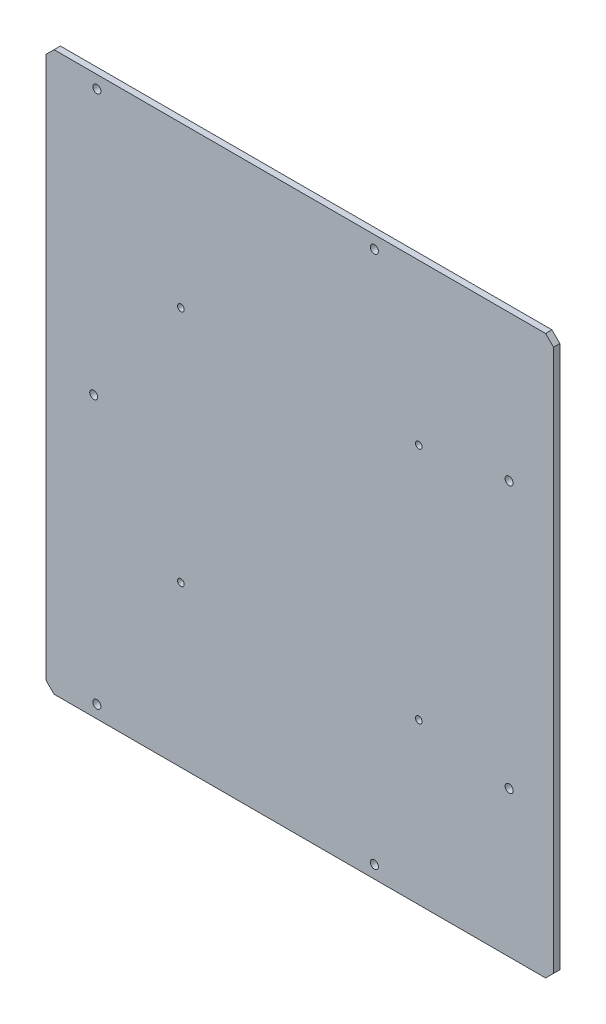
ISO-10303-21;
HEADER;
FILE_DESCRIPTION(('STEP AP214'),'2;1');
FILE_NAME('part.step','',(''),(''),'','','');
FILE_SCHEMA(('AUTOMOTIVE_DESIGN { 1 0 10303 214 1 1 1 1 }'));
ENDSEC;
DATA;
#1=APPLICATION_CONTEXT('core data for automotive mechanical design processes');
#2=APPLICATION_PROTOCOL_DEFINITION('international standard','automotive_design',2000,#1);
#3=PRODUCT_CONTEXT('',#1,'mechanical');
#4=PRODUCT('Part','Part','',(#3));
#5=PRODUCT_RELATED_PRODUCT_CATEGORY('part','',(#4));
#6=PRODUCT_DEFINITION_FORMATION('','',#4);
#7=PRODUCT_DEFINITION_CONTEXT('part definition',#1,'design');
#8=PRODUCT_DEFINITION('design','',#6,#7);
#9=PRODUCT_DEFINITION_SHAPE('','',#8);
#10=(LENGTH_UNIT() NAMED_UNIT(*) SI_UNIT(.MILLI.,.METRE.));
#11=(NAMED_UNIT(*) PLANE_ANGLE_UNIT() SI_UNIT($,.RADIAN.));
#12=(NAMED_UNIT(*) SI_UNIT($,.STERADIAN.) SOLID_ANGLE_UNIT());
#13=UNCERTAINTY_MEASURE_WITH_UNIT(LENGTH_MEASURE(1.E-05),#10,'distance_accuracy_value','');
#14=(GEOMETRIC_REPRESENTATION_CONTEXT(3) GLOBAL_UNCERTAINTY_ASSIGNED_CONTEXT((#13)) GLOBAL_UNIT_ASSIGNED_CONTEXT((#10,
#11,#12)) REPRESENTATION_CONTEXT('',''));
#15=CARTESIAN_POINT('',(0.,0.,0.));
#16=DIRECTION('',(0.,0.,1.));
#17=DIRECTION('',(1.,0.,0.));
#18=AXIS2_PLACEMENT_3D('',#15,#16,#17);
#19=CARTESIAN_POINT('',(155.,176.,4.));
#20=DIRECTION('',(0.,-1.,0.));
#21=DIRECTION('',(1.,0.,0.));
#22=AXIS2_PLACEMENT_3D('',#19,#20,#21);
#23=PLANE('',#22);
#24=DIRECTION('',(-1.,0.,0.));
#25=VECTOR('',#24,1.);
#26=CARTESIAN_POINT('',(155.,176.,0.));
#27=LINE('',#26,#25);
#28=CARTESIAN_POINT('',(155.,176.,0.));
#29=VERTEX_POINT('',#28);
#30=CARTESIAN_POINT('',(-155.,176.,0.));
#31=VERTEX_POINT('',#30);
#32=EDGE_CURVE('E128',#29,#31,#27,.T.);
#33=ORIENTED_EDGE('',*,*,#32,.T.);
#34=DIRECTION('',(0.,0.,-1.));
#35=VECTOR('',#34,1.);
#36=CARTESIAN_POINT('',(-155.,176.,4.));
#37=LINE('',#36,#35);
#38=CARTESIAN_POINT('',(-155.,176.,4.));
#39=VERTEX_POINT('',#38);
#40=EDGE_CURVE('E11',#39,#31,#37,.T.);
#41=ORIENTED_EDGE('',*,*,#40,.F.);
#42=DIRECTION('',(-1.,0.,0.));
#43=VECTOR('',#42,1.);
#44=CARTESIAN_POINT('',(155.,176.,4.));
#45=LINE('',#44,#43);
#46=CARTESIAN_POINT('',(155.,176.,4.));
#47=VERTEX_POINT('',#46);
#48=EDGE_CURVE('E143',#47,#39,#45,.T.);
#49=ORIENTED_EDGE('',*,*,#48,.F.);
#50=DIRECTION('',(0.,0.,-1.));
#51=VECTOR('',#50,1.);
#52=CARTESIAN_POINT('',(155.,176.,4.));
#53=LINE('',#52,#51);
#54=EDGE_CURVE('E124',#47,#29,#53,.T.);
#55=ORIENTED_EDGE('',*,*,#54,.T.);
#56=EDGE_LOOP('',(#33,#41,#49,#55));
#57=FACE_BOUND('',#56,.T.);
#58=ADVANCED_FACE('F32',(#57),#23,.F.);
#59=CARTESIAN_POINT('',(-155.,176.,4.));
#60=DIRECTION('',(0.70710678118655,-0.707106781186546,0.));
#61=DIRECTION('',(0.707106781186546,0.70710678118655,0.));
#62=AXIS2_PLACEMENT_3D('',#59,#60,#61);
#63=PLANE('',#62);
#64=DIRECTION('',(-0.707106781186545,-0.707106781186549,0.));
#65=VECTOR('',#64,1.);
#66=CARTESIAN_POINT('',(-155.,176.,0.));
#67=LINE('',#66,#65);
#68=CARTESIAN_POINT('',(-160.,171.,0.));
#69=VERTEX_POINT('',#68);
#70=EDGE_CURVE('E131',#31,#69,#67,.T.);
#71=ORIENTED_EDGE('',*,*,#70,.T.);
#72=DIRECTION('',(0.,0.,-1.));
#73=VECTOR('',#72,1.);
#74=CARTESIAN_POINT('',(-160.,171.,4.));
#75=LINE('',#74,#73);
#76=CARTESIAN_POINT('',(-160.,171.,4.));
#77=VERTEX_POINT('',#76);
#78=EDGE_CURVE('E40',#77,#69,#75,.T.);
#79=ORIENTED_EDGE('',*,*,#78,.F.);
#80=DIRECTION('',(-0.707106781186545,-0.707106781186549,0.));
#81=VECTOR('',#80,1.);
#82=CARTESIAN_POINT('',(-155.,176.,4.));
#83=LINE('',#82,#81);
#84=EDGE_CURVE('E91',#39,#77,#83,.T.);
#85=ORIENTED_EDGE('',*,*,#84,.F.);
#86=ORIENTED_EDGE('',*,*,#40,.T.);
#87=EDGE_LOOP('',(#71,#79,#85,#86));
#88=FACE_BOUND('',#87,.T.);
#89=ADVANCED_FACE('F288',(#88),#63,.F.);
#90=CARTESIAN_POINT('',(-160.,-171.,4.));
#91=DIRECTION('',(1.,0.,0.));
#92=DIRECTION('',(0.,0.,-1.));
#93=AXIS2_PLACEMENT_3D('',#90,#91,#92);
#94=PLANE('',#93);
#95=DIRECTION('',(0.,-1.,0.));
#96=VECTOR('',#95,1.);
#97=CARTESIAN_POINT('',(-160.,-171.,0.));
#98=LINE('',#97,#96);
#99=CARTESIAN_POINT('',(-160.,-171.,0.));
#100=VERTEX_POINT('',#99);
#101=EDGE_CURVE('E134',#69,#100,#98,.T.);
#102=ORIENTED_EDGE('',*,*,#101,.T.);
#103=DIRECTION('',(0.,0.,-1.));
#104=VECTOR('',#103,1.);
#105=CARTESIAN_POINT('',(-160.,-171.,4.));
#106=LINE('',#105,#104);
#107=CARTESIAN_POINT('',(-160.,-171.,4.));
#108=VERTEX_POINT('',#107);
#109=EDGE_CURVE('E150',#108,#100,#106,.T.);
#110=ORIENTED_EDGE('',*,*,#109,.F.);
#111=DIRECTION('',(0.,-1.,0.));
#112=VECTOR('',#111,1.);
#113=CARTESIAN_POINT('',(-160.,-171.,4.));
#114=LINE('',#113,#112);
#115=EDGE_CURVE('E158',#77,#108,#114,.T.);
#116=ORIENTED_EDGE('',*,*,#115,.F.);
#117=ORIENTED_EDGE('',*,*,#78,.T.);
#118=EDGE_LOOP('',(#102,#110,#116,#117));
#119=FACE_BOUND('',#118,.T.);
#120=ADVANCED_FACE('F156',(#119),#94,.F.);
#121=CARTESIAN_POINT('',(-155.,-176.,4.));
#122=DIRECTION('',(0.707106781186547,0.707106781186547,0.));
#123=DIRECTION('',(-0.707106781186548,0.707106781186548,0.));
#124=AXIS2_PLACEMENT_3D('',#121,#122,#123);
#125=PLANE('',#124);
#126=DIRECTION('',(0.707106781186547,-0.707106781186547,0.));
#127=VECTOR('',#126,1.);
#128=CARTESIAN_POINT('',(-155.,-176.,0.));
#129=LINE('',#128,#127);
#130=CARTESIAN_POINT('',(-155.,-176.,0.));
#131=VERTEX_POINT('',#130);
#132=EDGE_CURVE('E136',#100,#131,#129,.T.);
#133=ORIENTED_EDGE('',*,*,#132,.T.);
#134=DIRECTION('',(0.,0.,-1.));
#135=VECTOR('',#134,1.);
#136=CARTESIAN_POINT('',(-155.,-176.,4.));
#137=LINE('',#136,#135);
#138=CARTESIAN_POINT('',(-155.,-176.,4.));
#139=VERTEX_POINT('',#138);
#140=EDGE_CURVE('E147',#139,#131,#137,.T.);
#141=ORIENTED_EDGE('',*,*,#140,.F.);
#142=DIRECTION('',(0.707106781186547,-0.707106781186547,0.));
#143=VECTOR('',#142,1.);
#144=CARTESIAN_POINT('',(-155.,-176.,4.));
#145=LINE('',#144,#143);
#146=EDGE_CURVE('E170',#108,#139,#145,.T.);
#147=ORIENTED_EDGE('',*,*,#146,.F.);
#148=ORIENTED_EDGE('',*,*,#109,.T.);
#149=EDGE_LOOP('',(#133,#141,#147,#148));
#150=FACE_BOUND('',#149,.T.);
#151=ADVANCED_FACE('F166',(#150),#125,.F.);
#152=CARTESIAN_POINT('',(155.,-176.,4.));
#153=DIRECTION('',(0.,1.,0.));
#154=DIRECTION('',(-1.,0.,0.));
#155=AXIS2_PLACEMENT_3D('',#152,#153,#154);
#156=PLANE('',#155);
#157=DIRECTION('',(1.,0.,0.));
#158=VECTOR('',#157,1.);
#159=CARTESIAN_POINT('',(155.,-176.,0.));
#160=LINE('',#159,#158);
#161=CARTESIAN_POINT('',(155.,-176.,0.));
#162=VERTEX_POINT('',#161);
#163=EDGE_CURVE('E138',#131,#162,#160,.T.);
#164=ORIENTED_EDGE('',*,*,#163,.T.);
#165=DIRECTION('',(0.,0.,-1.));
#166=VECTOR('',#165,1.);
#167=CARTESIAN_POINT('',(155.,-176.,4.));
#168=LINE('',#167,#166);
#169=CARTESIAN_POINT('',(155.,-176.,4.));
#170=VERTEX_POINT('',#169);
#171=EDGE_CURVE('E119',#170,#162,#168,.T.);
#172=ORIENTED_EDGE('',*,*,#171,.F.);
#173=DIRECTION('',(1.,0.,0.));
#174=VECTOR('',#173,1.);
#175=CARTESIAN_POINT('',(155.,-176.,4.));
#176=LINE('',#175,#174);
#177=EDGE_CURVE('E110',#139,#170,#176,.T.);
#178=ORIENTED_EDGE('',*,*,#177,.F.);
#179=ORIENTED_EDGE('',*,*,#140,.T.);
#180=EDGE_LOOP('',(#164,#172,#178,#179));
#181=FACE_BOUND('',#180,.T.);
#182=ADVANCED_FACE('F169',(#181),#156,.F.);
#183=CARTESIAN_POINT('',(160.,-171.,4.));
#184=DIRECTION('',(-0.707106781186547,0.707106781186547,0.));
#185=DIRECTION('',(-0.707106781186548,-0.707106781186548,0.));
#186=AXIS2_PLACEMENT_3D('',#183,#184,#185);
#187=PLANE('',#186);
#188=DIRECTION('',(0.707106781186547,0.707106781186547,0.));
#189=VECTOR('',#188,1.);
#190=CARTESIAN_POINT('',(160.,-171.,0.));
#191=LINE('',#190,#189);
#192=CARTESIAN_POINT('',(160.,-171.,0.));
#193=VERTEX_POINT('',#192);
#194=EDGE_CURVE('E118',#162,#193,#191,.T.);
#195=ORIENTED_EDGE('',*,*,#194,.T.);
#196=DIRECTION('',(0.,0.,-1.));
#197=VECTOR('',#196,1.);
#198=CARTESIAN_POINT('',(160.,-171.,4.));
#199=LINE('',#198,#197);
#200=CARTESIAN_POINT('',(160.,-171.,4.));
#201=VERTEX_POINT('',#200);
#202=EDGE_CURVE('E115',#201,#193,#199,.T.);
#203=ORIENTED_EDGE('',*,*,#202,.F.);
#204=DIRECTION('',(0.707106781186547,0.707106781186547,0.));
#205=VECTOR('',#204,1.);
#206=CARTESIAN_POINT('',(160.,-171.,4.));
#207=LINE('',#206,#205);
#208=EDGE_CURVE('E104',#170,#201,#207,.T.);
#209=ORIENTED_EDGE('',*,*,#208,.F.);
#210=ORIENTED_EDGE('',*,*,#171,.T.);
#211=EDGE_LOOP('',(#195,#203,#209,#210));
#212=FACE_BOUND('',#211,.T.);
#213=ADVANCED_FACE('F116',(#212),#187,.F.);
#214=CARTESIAN_POINT('',(160.,-171.,4.));
#215=DIRECTION('',(-1.,0.,0.));
#216=DIRECTION('',(0.,0.,1.));
#217=AXIS2_PLACEMENT_3D('',#214,#215,#216);
#218=PLANE('',#217);
#219=DIRECTION('',(0.,1.,0.));
#220=VECTOR('',#219,1.);
#221=CARTESIAN_POINT('',(160.,-171.,0.));
#222=LINE('',#221,#220);
#223=CARTESIAN_POINT('',(160.,171.,0.));
#224=VERTEX_POINT('',#223);
#225=EDGE_CURVE('E77',#193,#224,#222,.T.);
#226=ORIENTED_EDGE('',*,*,#225,.T.);
#227=DIRECTION('',(0.,0.,-1.));
#228=VECTOR('',#227,1.);
#229=CARTESIAN_POINT('',(160.,171.,4.));
#230=LINE('',#229,#228);
#231=CARTESIAN_POINT('',(160.,171.,4.));
#232=VERTEX_POINT('',#231);
#233=EDGE_CURVE('E120',#232,#224,#230,.T.);
#234=ORIENTED_EDGE('',*,*,#233,.F.);
#235=DIRECTION('',(0.,1.,0.));
#236=VECTOR('',#235,1.);
#237=CARTESIAN_POINT('',(160.,-171.,4.));
#238=LINE('',#237,#236);
#239=EDGE_CURVE('E108',#201,#232,#238,.T.);
#240=ORIENTED_EDGE('',*,*,#239,.F.);
#241=ORIENTED_EDGE('',*,*,#202,.T.);
#242=EDGE_LOOP('',(#226,#234,#240,#241));
#243=FACE_BOUND('',#242,.T.);
#244=ADVANCED_FACE('F122',(#243),#218,.F.);
#245=CARTESIAN_POINT('',(160.,171.,4.));
#246=DIRECTION('',(-0.707106781186552,-0.707106781186544,0.));
#247=DIRECTION('',(0.707106781186544,-0.707106781186551,0.));
#248=AXIS2_PLACEMENT_3D('',#245,#246,#247);
#249=PLANE('',#248);
#250=DIRECTION('',(-0.707106781186543,0.707106781186551,0.));
#251=VECTOR('',#250,1.);
#252=CARTESIAN_POINT('',(160.,171.,0.));
#253=LINE('',#252,#251);
#254=EDGE_CURVE('E83',#224,#29,#253,.T.);
#255=ORIENTED_EDGE('',*,*,#254,.T.);
#256=ORIENTED_EDGE('',*,*,#54,.F.);
#257=DIRECTION('',(-0.707106781186543,0.707106781186551,0.));
#258=VECTOR('',#257,1.);
#259=CARTESIAN_POINT('',(160.,171.,4.));
#260=LINE('',#259,#258);
#261=EDGE_CURVE('E48',#232,#47,#260,.T.);
#262=ORIENTED_EDGE('',*,*,#261,.F.);
#263=ORIENTED_EDGE('',*,*,#233,.T.);
#264=EDGE_LOOP('',(#255,#256,#262,#263));
#265=FACE_BOUND('',#264,.T.);
#266=ADVANCED_FACE('F253',(#265),#249,.F.);
#267=CARTESIAN_POINT('',(0.,0.,4.));
#268=DIRECTION('',(0.,0.,-1.));
#269=DIRECTION('',(-1.,0.,0.));
#270=AXIS2_PLACEMENT_3D('',#267,#268,#269);
#271=PLANE('',#270);
#272=CARTESIAN_POINT('',(75.,-75.,4.));
#273=DIRECTION('',(0.,0.,1.));
#274=DIRECTION('',(-1.,0.,0.));
#275=AXIS2_PLACEMENT_3D('',#272,#273,#274);
#276=CIRCLE('',#275,2.1);
#277=CARTESIAN_POINT('',(72.9,-75.,4.));
#278=VERTEX_POINT('',#277);
#279=EDGE_CURVE('E236',#278,#278,#276,.T.);
#280=ORIENTED_EDGE('',*,*,#279,.F.);
#281=EDGE_LOOP('',(#280));
#282=FACE_BOUND('',#281,.T.);
#283=CARTESIAN_POINT('',(75.,75.,4.));
#284=DIRECTION('',(0.,0.,1.));
#285=DIRECTION('',(1.,0.,0.));
#286=AXIS2_PLACEMENT_3D('',#283,#284,#285);
#287=CIRCLE('',#286,2.1);
#288=CARTESIAN_POINT('',(77.1,75.,4.));
#289=VERTEX_POINT('',#288);
#290=EDGE_CURVE('E230',#289,#289,#287,.T.);
#291=ORIENTED_EDGE('',*,*,#290,.F.);
#292=EDGE_LOOP('',(#291));
#293=FACE_BOUND('',#292,.T.);
#294=CARTESIAN_POINT('',(-75.,75.,4.));
#295=DIRECTION('',(0.,0.,1.));
#296=DIRECTION('',(-1.,0.,0.));
#297=AXIS2_PLACEMENT_3D('',#294,#295,#296);
#298=CIRCLE('',#297,2.1);
#299=CARTESIAN_POINT('',(-77.1,75.,4.));
#300=VERTEX_POINT('',#299);
#301=EDGE_CURVE('E224',#300,#300,#298,.T.);
#302=ORIENTED_EDGE('',*,*,#301,.F.);
#303=EDGE_LOOP('',(#302));
#304=FACE_BOUND('',#303,.T.);
#305=CARTESIAN_POINT('',(-75.,-75.,4.));
#306=DIRECTION('',(0.,0.,1.));
#307=DIRECTION('',(1.,0.,0.));
#308=AXIS2_PLACEMENT_3D('',#305,#306,#307);
#309=CIRCLE('',#308,2.1);
#310=CARTESIAN_POINT('',(-72.9,-75.,4.));
#311=VERTEX_POINT('',#310);
#312=EDGE_CURVE('E218',#311,#311,#309,.T.);
#313=ORIENTED_EDGE('',*,*,#312,.F.);
#314=EDGE_LOOP('',(#313));
#315=FACE_BOUND('',#314,.T.);
#316=CARTESIAN_POINT('',(47.,168.,4.));
#317=DIRECTION('',(0.,0.,1.));
#318=DIRECTION('',(1.,0.,0.));
#319=AXIS2_PLACEMENT_3D('',#316,#317,#318);
#320=CIRCLE('',#319,2.55000000000005);
#321=CARTESIAN_POINT('',(49.55,168.,4.));
#322=VERTEX_POINT('',#321);
#323=EDGE_CURVE('E213',#322,#322,#320,.T.);
#324=ORIENTED_EDGE('',*,*,#323,.F.);
#325=EDGE_LOOP('',(#324));
#326=FACE_BOUND('',#325,.T.);
#327=CARTESIAN_POINT('',(132.,84.,4.));
#328=DIRECTION('',(0.,0.,1.));
#329=DIRECTION('',(1.,0.,0.));
#330=AXIS2_PLACEMENT_3D('',#327,#328,#329);
#331=CIRCLE('',#330,2.55000000000005);
#332=CARTESIAN_POINT('',(134.55,84.,4.));
#333=VERTEX_POINT('',#332);
#334=EDGE_CURVE('E207',#333,#333,#331,.T.);
#335=ORIENTED_EDGE('',*,*,#334,.F.);
#336=EDGE_LOOP('',(#335));
#337=FACE_BOUND('',#336,.T.);
#338=CARTESIAN_POINT('',(132.,-84.,4.));
#339=DIRECTION('',(0.,0.,1.));
#340=DIRECTION('',(1.,0.,0.));
#341=AXIS2_PLACEMENT_3D('',#338,#339,#340);
#342=CIRCLE('',#341,2.55000000000005);
#343=CARTESIAN_POINT('',(134.55,-84.,4.));
#344=VERTEX_POINT('',#343);
#345=EDGE_CURVE('E201',#344,#344,#342,.T.);
#346=ORIENTED_EDGE('',*,*,#345,.F.);
#347=EDGE_LOOP('',(#346));
#348=FACE_BOUND('',#347,.T.);
#349=CARTESIAN_POINT('',(47.,-168.,4.));
#350=DIRECTION('',(0.,0.,1.));
#351=DIRECTION('',(1.,0.,0.));
#352=AXIS2_PLACEMENT_3D('',#349,#350,#351);
#353=CIRCLE('',#352,2.55000000000005);
#354=CARTESIAN_POINT('',(49.55,-168.,4.));
#355=VERTEX_POINT('',#354);
#356=EDGE_CURVE('E195',#355,#355,#353,.T.);
#357=ORIENTED_EDGE('',*,*,#356,.F.);
#358=EDGE_LOOP('',(#357));
#359=FACE_BOUND('',#358,.T.);
#360=CARTESIAN_POINT('',(-128.,-168.,4.));
#361=DIRECTION('',(0.,0.,1.));
#362=DIRECTION('',(1.,0.,0.));
#363=AXIS2_PLACEMENT_3D('',#360,#361,#362);
#364=CIRCLE('',#363,2.55000000000005);
#365=CARTESIAN_POINT('',(-125.45,-168.,4.));
#366=VERTEX_POINT('',#365);
#367=EDGE_CURVE('E188',#366,#366,#364,.T.);
#368=ORIENTED_EDGE('',*,*,#367,.F.);
#369=EDGE_LOOP('',(#368));
#370=FACE_BOUND('',#369,.T.);
#371=CARTESIAN_POINT('',(-128.,168.,4.));
#372=DIRECTION('',(0.,0.,1.));
#373=DIRECTION('',(1.,0.,0.));
#374=AXIS2_PLACEMENT_3D('',#371,#372,#373);
#375=CIRCLE('',#374,2.55000000000005);
#376=CARTESIAN_POINT('',(-125.45,168.,4.));
#377=VERTEX_POINT('',#376);
#378=EDGE_CURVE('E179',#377,#377,#375,.T.);
#379=ORIENTED_EDGE('',*,*,#378,.F.);
#380=EDGE_LOOP('',(#379));
#381=FACE_BOUND('',#380,.T.);
#382=CARTESIAN_POINT('',(-130.,0.,4.));
#383=DIRECTION('',(0.,0.,-1.));
#384=DIRECTION('',(-1.,0.,0.));
#385=AXIS2_PLACEMENT_3D('',#382,#383,#384);
#386=CIRCLE('',#385,2.5);
#387=CARTESIAN_POINT('',(-132.5,0.,4.));
#388=VERTEX_POINT('',#387);
#389=EDGE_CURVE('E132',#388,#388,#386,.T.);
#390=ORIENTED_EDGE('',*,*,#389,.T.);
#391=EDGE_LOOP('',(#390));
#392=FACE_BOUND('',#391,.T.);
#393=ORIENTED_EDGE('',*,*,#48,.T.);
#394=ORIENTED_EDGE('',*,*,#84,.T.);
#395=ORIENTED_EDGE('',*,*,#115,.T.);
#396=ORIENTED_EDGE('',*,*,#146,.T.);
#397=ORIENTED_EDGE('',*,*,#177,.T.);
#398=ORIENTED_EDGE('',*,*,#208,.T.);
#399=ORIENTED_EDGE('',*,*,#239,.T.);
#400=ORIENTED_EDGE('',*,*,#261,.T.);
#401=EDGE_LOOP('',(#393,#394,#395,#396,#397,#398,#399,#400));
#402=FACE_BOUND('',#401,.T.);
#403=ADVANCED_FACE('F106',(#282,#293,#304,#315,#326,#337,#348,#359,#370,#381,#392,#402),#271,.F.);
#404=CARTESIAN_POINT('',(0.,0.,0.));
#405=DIRECTION('',(0.,0.,-1.));
#406=DIRECTION('',(-1.,0.,0.));
#407=AXIS2_PLACEMENT_3D('',#404,#405,#406);
#408=PLANE('',#407);
#409=CARTESIAN_POINT('',(75.,-75.,0.));
#410=DIRECTION('',(0.,0.,1.));
#411=DIRECTION('',(-1.,0.,0.));
#412=AXIS2_PLACEMENT_3D('',#409,#410,#411);
#413=CIRCLE('',#412,2.1);
#414=CARTESIAN_POINT('',(72.9,-75.,0.));
#415=VERTEX_POINT('',#414);
#416=EDGE_CURVE('E221',#415,#415,#413,.T.);
#417=ORIENTED_EDGE('',*,*,#416,.T.);
#418=EDGE_LOOP('',(#417));
#419=FACE_BOUND('',#418,.T.);
#420=CARTESIAN_POINT('',(75.,75.,0.));
#421=DIRECTION('',(0.,0.,1.));
#422=DIRECTION('',(1.,0.,0.));
#423=AXIS2_PLACEMENT_3D('',#420,#421,#422);
#424=CIRCLE('',#423,2.1);
#425=CARTESIAN_POINT('',(77.1,75.,0.));
#426=VERTEX_POINT('',#425);
#427=EDGE_CURVE('E233',#426,#426,#424,.T.);
#428=ORIENTED_EDGE('',*,*,#427,.T.);
#429=EDGE_LOOP('',(#428));
#430=FACE_BOUND('',#429,.T.);
#431=CARTESIAN_POINT('',(-75.,75.,0.));
#432=DIRECTION('',(0.,0.,1.));
#433=DIRECTION('',(-1.,0.,0.));
#434=AXIS2_PLACEMENT_3D('',#431,#432,#433);
#435=CIRCLE('',#434,2.1);
#436=CARTESIAN_POINT('',(-77.1,75.,0.));
#437=VERTEX_POINT('',#436);
#438=EDGE_CURVE('E227',#437,#437,#435,.T.);
#439=ORIENTED_EDGE('',*,*,#438,.T.);
#440=EDGE_LOOP('',(#439));
#441=FACE_BOUND('',#440,.T.);
#442=CARTESIAN_POINT('',(-75.,-75.,0.));
#443=DIRECTION('',(0.,0.,1.));
#444=DIRECTION('',(1.,0.,0.));
#445=AXIS2_PLACEMENT_3D('',#442,#443,#444);
#446=CIRCLE('',#445,2.1);
#447=CARTESIAN_POINT('',(-72.9,-75.,0.));
#448=VERTEX_POINT('',#447);
#449=EDGE_CURVE('E192',#448,#448,#446,.T.);
#450=ORIENTED_EDGE('',*,*,#449,.T.);
#451=EDGE_LOOP('',(#450));
#452=FACE_BOUND('',#451,.T.);
#453=CARTESIAN_POINT('',(47.,168.,0.));
#454=DIRECTION('',(0.,0.,1.));
#455=DIRECTION('',(1.,0.,0.));
#456=AXIS2_PLACEMENT_3D('',#453,#454,#455);
#457=CIRCLE('',#456,2.55000000000005);
#458=CARTESIAN_POINT('',(49.55,168.,0.));
#459=VERTEX_POINT('',#458);
#460=EDGE_CURVE('E185',#459,#459,#457,.T.);
#461=ORIENTED_EDGE('',*,*,#460,.T.);
#462=EDGE_LOOP('',(#461));
#463=FACE_BOUND('',#462,.T.);
#464=CARTESIAN_POINT('',(132.,84.,0.));
#465=DIRECTION('',(0.,0.,1.));
#466=DIRECTION('',(1.,0.,0.));
#467=AXIS2_PLACEMENT_3D('',#464,#465,#466);
#468=CIRCLE('',#467,2.55000000000005);
#469=CARTESIAN_POINT('',(134.55,84.,0.));
#470=VERTEX_POINT('',#469);
#471=EDGE_CURVE('E210',#470,#470,#468,.T.);
#472=ORIENTED_EDGE('',*,*,#471,.T.);
#473=EDGE_LOOP('',(#472));
#474=FACE_BOUND('',#473,.T.);
#475=CARTESIAN_POINT('',(132.,-84.,0.));
#476=DIRECTION('',(0.,0.,1.));
#477=DIRECTION('',(1.,0.,0.));
#478=AXIS2_PLACEMENT_3D('',#475,#476,#477);
#479=CIRCLE('',#478,2.55000000000005);
#480=CARTESIAN_POINT('',(134.55,-84.,0.));
#481=VERTEX_POINT('',#480);
#482=EDGE_CURVE('E204',#481,#481,#479,.T.);
#483=ORIENTED_EDGE('',*,*,#482,.T.);
#484=EDGE_LOOP('',(#483));
#485=FACE_BOUND('',#484,.T.);
#486=CARTESIAN_POINT('',(47.,-168.,0.));
#487=DIRECTION('',(0.,0.,1.));
#488=DIRECTION('',(1.,0.,0.));
#489=AXIS2_PLACEMENT_3D('',#486,#487,#488);
#490=CIRCLE('',#489,2.55000000000005);
#491=CARTESIAN_POINT('',(49.55,-168.,0.));
#492=VERTEX_POINT('',#491);
#493=EDGE_CURVE('E198',#492,#492,#490,.T.);
#494=ORIENTED_EDGE('',*,*,#493,.T.);
#495=EDGE_LOOP('',(#494));
#496=FACE_BOUND('',#495,.T.);
#497=CARTESIAN_POINT('',(-128.,-168.,0.));
#498=DIRECTION('',(0.,0.,1.));
#499=DIRECTION('',(1.,0.,0.));
#500=AXIS2_PLACEMENT_3D('',#497,#498,#499);
#501=CIRCLE('',#500,2.55000000000005);
#502=CARTESIAN_POINT('',(-125.45,-168.,0.));
#503=VERTEX_POINT('',#502);
#504=EDGE_CURVE('E191',#503,#503,#501,.T.);
#505=ORIENTED_EDGE('',*,*,#504,.T.);
#506=EDGE_LOOP('',(#505));
#507=FACE_BOUND('',#506,.T.);
#508=CARTESIAN_POINT('',(-128.,168.,0.));
#509=DIRECTION('',(0.,0.,1.));
#510=DIRECTION('',(1.,0.,0.));
#511=AXIS2_PLACEMENT_3D('',#508,#509,#510);
#512=CIRCLE('',#511,2.55000000000005);
#513=CARTESIAN_POINT('',(-125.45,168.,0.));
#514=VERTEX_POINT('',#513);
#515=EDGE_CURVE('E182',#514,#514,#512,.T.);
#516=ORIENTED_EDGE('',*,*,#515,.T.);
#517=EDGE_LOOP('',(#516));
#518=FACE_BOUND('',#517,.T.);
#519=CARTESIAN_POINT('',(-130.,0.,0.));
#520=DIRECTION('',(0.,0.,-1.));
#521=DIRECTION('',(-1.,0.,0.));
#522=AXIS2_PLACEMENT_3D('',#519,#520,#521);
#523=CIRCLE('',#522,2.5);
#524=CARTESIAN_POINT('',(-132.5,0.,0.));
#525=VERTEX_POINT('',#524);
#526=EDGE_CURVE('E176',#525,#525,#523,.T.);
#527=ORIENTED_EDGE('',*,*,#526,.F.);
#528=EDGE_LOOP('',(#527));
#529=FACE_BOUND('',#528,.T.);
#530=ORIENTED_EDGE('',*,*,#32,.F.);
#531=ORIENTED_EDGE('',*,*,#254,.F.);
#532=ORIENTED_EDGE('',*,*,#225,.F.);
#533=ORIENTED_EDGE('',*,*,#194,.F.);
#534=ORIENTED_EDGE('',*,*,#163,.F.);
#535=ORIENTED_EDGE('',*,*,#132,.F.);
#536=ORIENTED_EDGE('',*,*,#101,.F.);
#537=ORIENTED_EDGE('',*,*,#70,.F.);
#538=EDGE_LOOP('',(#530,#531,#532,#533,#534,#535,#536,#537));
#539=FACE_BOUND('',#538,.T.);
#540=ADVANCED_FACE('F162',(#419,#430,#441,#452,#463,#474,#485,#496,#507,#518,#529,#539),#408,.T.);
#541=CARTESIAN_POINT('',(-130.,0.,4.));
#542=DIRECTION('',(0.,0.,-1.));
#543=DIRECTION('',(-1.,0.,0.));
#544=AXIS2_PLACEMENT_3D('',#541,#542,#543);
#545=CYLINDRICAL_SURFACE('',#544,2.5);
#546=ORIENTED_EDGE('',*,*,#389,.F.);
#547=EDGE_LOOP('',(#546));
#548=FACE_BOUND('',#547,.T.);
#549=ORIENTED_EDGE('',*,*,#526,.T.);
#550=EDGE_LOOP('',(#549));
#551=FACE_BOUND('',#550,.T.);
#552=ADVANCED_FACE('F275',(#548,#551),#545,.F.);
#553=CARTESIAN_POINT('',(-128.,168.,4.));
#554=DIRECTION('',(0.,0.,-1.));
#555=DIRECTION('',(-1.,0.,0.));
#556=AXIS2_PLACEMENT_3D('',#553,#554,#555);
#557=CYLINDRICAL_SURFACE('',#556,2.55000000000005);
#558=ORIENTED_EDGE('',*,*,#378,.T.);
#559=EDGE_LOOP('',(#558));
#560=FACE_BOUND('',#559,.T.);
#561=ORIENTED_EDGE('',*,*,#515,.F.);
#562=EDGE_LOOP('',(#561));
#563=FACE_BOUND('',#562,.T.);
#564=ADVANCED_FACE('F278',(#560,#563),#557,.F.);
#565=CARTESIAN_POINT('',(-128.,-168.,4.));
#566=DIRECTION('',(0.,0.,-1.));
#567=DIRECTION('',(-1.,0.,0.));
#568=AXIS2_PLACEMENT_3D('',#565,#566,#567);
#569=CYLINDRICAL_SURFACE('',#568,2.55000000000005);
#570=ORIENTED_EDGE('',*,*,#367,.T.);
#571=EDGE_LOOP('',(#570));
#572=FACE_BOUND('',#571,.T.);
#573=ORIENTED_EDGE('',*,*,#504,.F.);
#574=EDGE_LOOP('',(#573));
#575=FACE_BOUND('',#574,.T.);
#576=ADVANCED_FACE('F349',(#572,#575),#569,.F.);
#577=CARTESIAN_POINT('',(47.,-168.,4.));
#578=DIRECTION('',(0.,0.,-1.));
#579=DIRECTION('',(-1.,0.,0.));
#580=AXIS2_PLACEMENT_3D('',#577,#578,#579);
#581=CYLINDRICAL_SURFACE('',#580,2.55000000000005);
#582=ORIENTED_EDGE('',*,*,#356,.T.);
#583=EDGE_LOOP('',(#582));
#584=FACE_BOUND('',#583,.T.);
#585=ORIENTED_EDGE('',*,*,#493,.F.);
#586=EDGE_LOOP('',(#585));
#587=FACE_BOUND('',#586,.T.);
#588=ADVANCED_FACE('F359',(#584,#587),#581,.F.);
#589=CARTESIAN_POINT('',(132.,-84.,4.));
#590=DIRECTION('',(0.,0.,-1.));
#591=DIRECTION('',(-1.,0.,0.));
#592=AXIS2_PLACEMENT_3D('',#589,#590,#591);
#593=CYLINDRICAL_SURFACE('',#592,2.55000000000005);
#594=ORIENTED_EDGE('',*,*,#345,.T.);
#595=EDGE_LOOP('',(#594));
#596=FACE_BOUND('',#595,.T.);
#597=ORIENTED_EDGE('',*,*,#482,.F.);
#598=EDGE_LOOP('',(#597));
#599=FACE_BOUND('',#598,.T.);
#600=ADVANCED_FACE('F369',(#596,#599),#593,.F.);
#601=CARTESIAN_POINT('',(132.,84.,4.));
#602=DIRECTION('',(0.,0.,-1.));
#603=DIRECTION('',(-1.,0.,0.));
#604=AXIS2_PLACEMENT_3D('',#601,#602,#603);
#605=CYLINDRICAL_SURFACE('',#604,2.55000000000005);
#606=ORIENTED_EDGE('',*,*,#334,.T.);
#607=EDGE_LOOP('',(#606));
#608=FACE_BOUND('',#607,.T.);
#609=ORIENTED_EDGE('',*,*,#471,.F.);
#610=EDGE_LOOP('',(#609));
#611=FACE_BOUND('',#610,.T.);
#612=ADVANCED_FACE('F379',(#608,#611),#605,.F.);
#613=CARTESIAN_POINT('',(47.,168.,4.));
#614=DIRECTION('',(0.,0.,-1.));
#615=DIRECTION('',(-1.,0.,0.));
#616=AXIS2_PLACEMENT_3D('',#613,#614,#615);
#617=CYLINDRICAL_SURFACE('',#616,2.55000000000005);
#618=ORIENTED_EDGE('',*,*,#323,.T.);
#619=EDGE_LOOP('',(#618));
#620=FACE_BOUND('',#619,.T.);
#621=ORIENTED_EDGE('',*,*,#460,.F.);
#622=EDGE_LOOP('',(#621));
#623=FACE_BOUND('',#622,.T.);
#624=ADVANCED_FACE('F389',(#620,#623),#617,.F.);
#625=CARTESIAN_POINT('',(-75.,-75.,0.));
#626=DIRECTION('',(0.,0.,1.));
#627=DIRECTION('',(1.,0.,0.));
#628=AXIS2_PLACEMENT_3D('',#625,#626,#627);
#629=CYLINDRICAL_SURFACE('',#628,2.1);
#630=ORIENTED_EDGE('',*,*,#449,.F.);
#631=EDGE_LOOP('',(#630));
#632=FACE_BOUND('',#631,.T.);
#633=ORIENTED_EDGE('',*,*,#312,.T.);
#634=EDGE_LOOP('',(#633));
#635=FACE_BOUND('',#634,.T.);
#636=ADVANCED_FACE('F399',(#632,#635),#629,.F.);
#637=CARTESIAN_POINT('',(-75.,75.,0.));
#638=DIRECTION('',(0.,0.,1.));
#639=DIRECTION('',(1.,0.,0.));
#640=AXIS2_PLACEMENT_3D('',#637,#638,#639);
#641=CYLINDRICAL_SURFACE('',#640,2.1);
#642=ORIENTED_EDGE('',*,*,#438,.F.);
#643=EDGE_LOOP('',(#642));
#644=FACE_BOUND('',#643,.T.);
#645=ORIENTED_EDGE('',*,*,#301,.T.);
#646=EDGE_LOOP('',(#645));
#647=FACE_BOUND('',#646,.T.);
#648=ADVANCED_FACE('F417',(#644,#647),#641,.F.);
#649=CARTESIAN_POINT('',(75.,75.,0.));
#650=DIRECTION('',(0.,0.,1.));
#651=DIRECTION('',(1.,0.,0.));
#652=AXIS2_PLACEMENT_3D('',#649,#650,#651);
#653=CYLINDRICAL_SURFACE('',#652,2.1);
#654=ORIENTED_EDGE('',*,*,#427,.F.);
#655=EDGE_LOOP('',(#654));
#656=FACE_BOUND('',#655,.T.);
#657=ORIENTED_EDGE('',*,*,#290,.T.);
#658=EDGE_LOOP('',(#657));
#659=FACE_BOUND('',#658,.T.);
#660=ADVANCED_FACE('F247',(#656,#659),#653,.F.);
#661=CARTESIAN_POINT('',(75.,-75.,0.));
#662=DIRECTION('',(0.,0.,1.));
#663=DIRECTION('',(1.,0.,0.));
#664=AXIS2_PLACEMENT_3D('',#661,#662,#663);
#665=CYLINDRICAL_SURFACE('',#664,2.1);
#666=ORIENTED_EDGE('',*,*,#416,.F.);
#667=EDGE_LOOP('',(#666));
#668=FACE_BOUND('',#667,.T.);
#669=ORIENTED_EDGE('',*,*,#279,.T.);
#670=EDGE_LOOP('',(#669));
#671=FACE_BOUND('',#670,.T.);
#672=ADVANCED_FACE('F244',(#668,#671),#665,.F.);
#673=CLOSED_SHELL('',(#58,#89,#120,#151,#182,#213,#244,#266,#403,#540,#552,#564,#576,#588,#600,
#612,#624,#636,#648,#660,#672));
#674=MANIFOLD_SOLID_BREP('B2',#673);
#675=ADVANCED_BREP_SHAPE_REPRESENTATION('',(#18,#674),#14);
#676=SHAPE_DEFINITION_REPRESENTATION(#9,#675);
ENDSEC;
END-ISO-10303-21;
